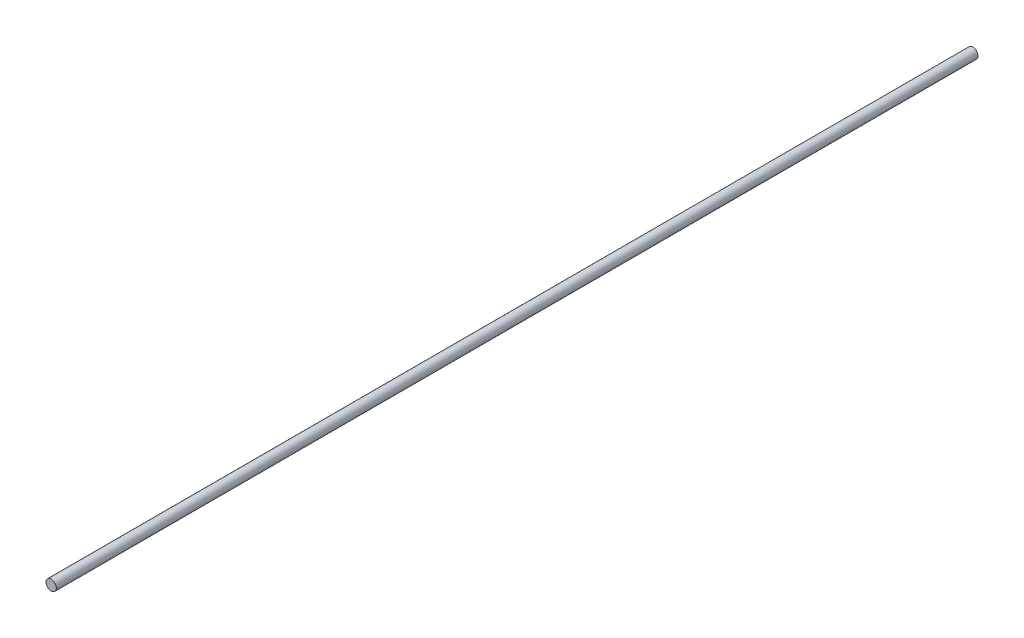
ISO-10303-21;
HEADER;
FILE_DESCRIPTION(('STEP AP214'),'2;1');
FILE_NAME('part.step','',(''),(''),'','','');
FILE_SCHEMA(('AUTOMOTIVE_DESIGN { 1 0 10303 214 1 1 1 1 }'));
ENDSEC;
DATA;
#1=APPLICATION_CONTEXT('core data for automotive mechanical design processes');
#2=APPLICATION_PROTOCOL_DEFINITION('international standard','automotive_design',2000,#1);
#3=PRODUCT_CONTEXT('',#1,'mechanical');
#4=PRODUCT('Part','Part','',(#3));
#5=PRODUCT_RELATED_PRODUCT_CATEGORY('part','',(#4));
#6=PRODUCT_DEFINITION_FORMATION('','',#4);
#7=PRODUCT_DEFINITION_CONTEXT('part definition',#1,'design');
#8=PRODUCT_DEFINITION('design','',#6,#7);
#9=PRODUCT_DEFINITION_SHAPE('','',#8);
#10=(LENGTH_UNIT() NAMED_UNIT(*) SI_UNIT(.MILLI.,.METRE.));
#11=(NAMED_UNIT(*) PLANE_ANGLE_UNIT() SI_UNIT($,.RADIAN.));
#12=(NAMED_UNIT(*) SI_UNIT($,.STERADIAN.) SOLID_ANGLE_UNIT());
#13=UNCERTAINTY_MEASURE_WITH_UNIT(LENGTH_MEASURE(1.E-05),#10,'distance_accuracy_value','');
#14=(GEOMETRIC_REPRESENTATION_CONTEXT(3) GLOBAL_UNCERTAINTY_ASSIGNED_CONTEXT((#13)) GLOBAL_UNIT_ASSIGNED_CONTEXT((#10,
#11,#12)) REPRESENTATION_CONTEXT('',''));
#15=CARTESIAN_POINT('',(0.,0.,0.));
#16=DIRECTION('',(0.,0.,1.));
#17=DIRECTION('',(1.,0.,0.));
#18=AXIS2_PLACEMENT_3D('',#15,#16,#17);
#19=CARTESIAN_POINT('',(0.,0.,681.));
#20=DIRECTION('',(0.,0.,-1.));
#21=DIRECTION('',(-1.,0.,0.));
#22=AXIS2_PLACEMENT_3D('',#19,#20,#21);
#23=CYLINDRICAL_SURFACE('',#22,3.815);
#24=CARTESIAN_POINT('',(0.,0.,681.));
#25=DIRECTION('',(0.,0.,1.));
#26=DIRECTION('',(1.,0.,0.));
#27=AXIS2_PLACEMENT_3D('',#24,#25,#26);
#28=CIRCLE('',#27,3.815);
#29=CARTESIAN_POINT('',(3.815,0.,681.));
#30=VERTEX_POINT('',#29);
#31=EDGE_CURVE('E10',#30,#30,#28,.T.);
#32=ORIENTED_EDGE('',*,*,#31,.F.);
#33=EDGE_LOOP('',(#32));
#34=FACE_BOUND('',#33,.T.);
#35=CARTESIAN_POINT('',(0.,0.,0.));
#36=DIRECTION('',(0.,0.,1.));
#37=DIRECTION('',(1.,0.,0.));
#38=AXIS2_PLACEMENT_3D('',#35,#36,#37);
#39=CIRCLE('',#38,3.815);
#40=CARTESIAN_POINT('',(3.815,0.,0.));
#41=VERTEX_POINT('',#40);
#42=EDGE_CURVE('E44',#41,#41,#39,.T.);
#43=ORIENTED_EDGE('',*,*,#42,.T.);
#44=EDGE_LOOP('',(#43));
#45=FACE_BOUND('',#44,.T.);
#46=ADVANCED_FACE('F41',(#34,#45),#23,.T.);
#47=CARTESIAN_POINT('',(0.,0.,681.));
#48=DIRECTION('',(0.,0.,1.));
#49=DIRECTION('',(1.,0.,0.));
#50=AXIS2_PLACEMENT_3D('',#47,#48,#49);
#51=PLANE('',#50);
#52=ORIENTED_EDGE('',*,*,#31,.T.);
#53=EDGE_LOOP('',(#52));
#54=FACE_BOUND('',#53,.T.);
#55=ADVANCED_FACE('F56',(#54),#51,.T.);
#56=CARTESIAN_POINT('',(0.,0.,0.));
#57=DIRECTION('',(0.,0.,1.));
#58=DIRECTION('',(1.,0.,0.));
#59=AXIS2_PLACEMENT_3D('',#56,#57,#58);
#60=PLANE('',#59);
#61=ORIENTED_EDGE('',*,*,#42,.F.);
#62=EDGE_LOOP('',(#61));
#63=FACE_BOUND('',#62,.T.);
#64=ADVANCED_FACE('F54',(#63),#60,.F.);
#65=CLOSED_SHELL('',(#46,#55,#64));
#66=MANIFOLD_SOLID_BREP('B2',#65);
#67=ADVANCED_BREP_SHAPE_REPRESENTATION('',(#18,#66),#14);
#68=SHAPE_DEFINITION_REPRESENTATION(#9,#67);
ENDSEC;
END-ISO-10303-21;
